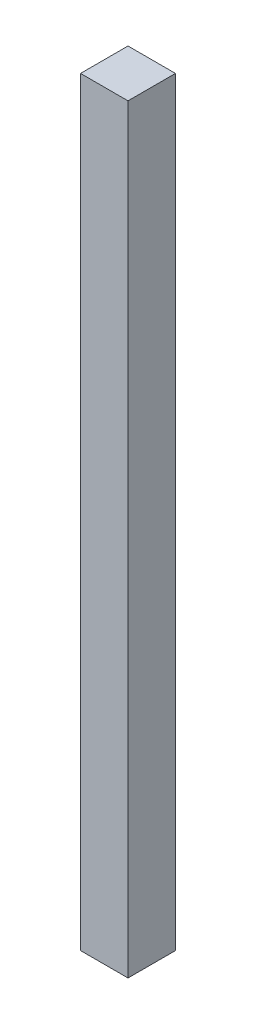
ISO-10303-21;
HEADER;
FILE_DESCRIPTION(('STEP AP214'),'2;1');
FILE_NAME('part.step','',(''),(''),'','','');
FILE_SCHEMA(('AUTOMOTIVE_DESIGN { 1 0 10303 214 1 1 1 1 }'));
ENDSEC;
DATA;
#1=APPLICATION_CONTEXT('core data for automotive mechanical design processes');
#2=APPLICATION_PROTOCOL_DEFINITION('international standard','automotive_design',2000,#1);
#3=PRODUCT_CONTEXT('',#1,'mechanical');
#4=PRODUCT('Part','Part','',(#3));
#5=PRODUCT_RELATED_PRODUCT_CATEGORY('part','',(#4));
#6=PRODUCT_DEFINITION_FORMATION('','',#4);
#7=PRODUCT_DEFINITION_CONTEXT('part definition',#1,'design');
#8=PRODUCT_DEFINITION('design','',#6,#7);
#9=PRODUCT_DEFINITION_SHAPE('','',#8);
#10=(LENGTH_UNIT() NAMED_UNIT(*) SI_UNIT(.MILLI.,.METRE.));
#11=(NAMED_UNIT(*) PLANE_ANGLE_UNIT() SI_UNIT($,.RADIAN.));
#12=(NAMED_UNIT(*) SI_UNIT($,.STERADIAN.) SOLID_ANGLE_UNIT());
#13=UNCERTAINTY_MEASURE_WITH_UNIT(LENGTH_MEASURE(1.E-05),#10,'distance_accuracy_value','');
#14=(GEOMETRIC_REPRESENTATION_CONTEXT(3) GLOBAL_UNCERTAINTY_ASSIGNED_CONTEXT((#13)) GLOBAL_UNIT_ASSIGNED_CONTEXT((#10,
#11,#12)) REPRESENTATION_CONTEXT('',''));
#15=CARTESIAN_POINT('',(0.,0.,0.));
#16=DIRECTION('',(0.,0.,1.));
#17=DIRECTION('',(1.,0.,0.));
#18=AXIS2_PLACEMENT_3D('',#15,#16,#17);
#19=CARTESIAN_POINT('',(0.,400.,0.));
#20=DIRECTION('',(1.,0.,0.));
#21=DIRECTION('',(0.,0.,-1.));
#22=AXIS2_PLACEMENT_3D('',#19,#20,#21);
#23=PLANE('',#22);
#24=DIRECTION('',(0.,0.,1.));
#25=VECTOR('',#24,1.);
#26=CARTESIAN_POINT('',(0.,0.,0.));
#27=LINE('',#26,#25);
#28=CARTESIAN_POINT('',(0.,0.,0.));
#29=VERTEX_POINT('',#28);
#30=CARTESIAN_POINT('',(0.,0.,25.));
#31=VERTEX_POINT('',#30);
#32=EDGE_CURVE('E98',#29,#31,#27,.T.);
#33=ORIENTED_EDGE('',*,*,#32,.F.);
#34=DIRECTION('',(0.,-1.,0.));
#35=VECTOR('',#34,1.);
#36=CARTESIAN_POINT('',(0.,400.,0.));
#37=LINE('',#36,#35);
#38=CARTESIAN_POINT('',(0.,400.,0.));
#39=VERTEX_POINT('',#38);
#40=EDGE_CURVE('E11',#39,#29,#37,.T.);
#41=ORIENTED_EDGE('',*,*,#40,.F.);
#42=DIRECTION('',(0.,0.,1.));
#43=VECTOR('',#42,1.);
#44=CARTESIAN_POINT('',(0.,400.,0.));
#45=LINE('',#44,#43);
#46=CARTESIAN_POINT('',(0.,400.,25.));
#47=VERTEX_POINT('',#46);
#48=EDGE_CURVE('E93',#39,#47,#45,.T.);
#49=ORIENTED_EDGE('',*,*,#48,.T.);
#50=DIRECTION('',(0.,-1.,0.));
#51=VECTOR('',#50,1.);
#52=CARTESIAN_POINT('',(0.,400.,25.));
#53=LINE('',#52,#51);
#54=EDGE_CURVE('E36',#47,#31,#53,.T.);
#55=ORIENTED_EDGE('',*,*,#54,.T.);
#56=EDGE_LOOP('',(#33,#41,#49,#55));
#57=FACE_BOUND('',#56,.T.);
#58=ADVANCED_FACE('F33',(#57),#23,.T.);
#59=CARTESIAN_POINT('',(0.,400.,0.));
#60=DIRECTION('',(0.,0.,1.));
#61=DIRECTION('',(1.,0.,0.));
#62=AXIS2_PLACEMENT_3D('',#59,#60,#61);
#63=PLANE('',#62);
#64=DIRECTION('',(-1.,0.,0.));
#65=VECTOR('',#64,1.);
#66=CARTESIAN_POINT('',(0.,0.,0.));
#67=LINE('',#66,#65);
#68=CARTESIAN_POINT('',(-25.,0.,0.));
#69=VERTEX_POINT('',#68);
#70=EDGE_CURVE('E66',#29,#69,#67,.T.);
#71=ORIENTED_EDGE('',*,*,#70,.T.);
#72=DIRECTION('',(0.,-1.,0.));
#73=VECTOR('',#72,1.);
#74=CARTESIAN_POINT('',(-25.,400.,0.));
#75=LINE('',#74,#73);
#76=CARTESIAN_POINT('',(-25.,400.,0.));
#77=VERTEX_POINT('',#76);
#78=EDGE_CURVE('E42',#77,#69,#75,.T.);
#79=ORIENTED_EDGE('',*,*,#78,.F.);
#80=DIRECTION('',(-1.,0.,0.));
#81=VECTOR('',#80,1.);
#82=CARTESIAN_POINT('',(0.,400.,0.));
#83=LINE('',#82,#81);
#84=EDGE_CURVE('E83',#39,#77,#83,.T.);
#85=ORIENTED_EDGE('',*,*,#84,.F.);
#86=ORIENTED_EDGE('',*,*,#40,.T.);
#87=EDGE_LOOP('',(#71,#79,#85,#86));
#88=FACE_BOUND('',#87,.T.);
#89=ADVANCED_FACE('F108',(#88),#63,.F.);
#90=CARTESIAN_POINT('',(-25.,400.,0.));
#91=DIRECTION('',(1.,0.,0.));
#92=DIRECTION('',(0.,0.,-1.));
#93=AXIS2_PLACEMENT_3D('',#90,#91,#92);
#94=PLANE('',#93);
#95=DIRECTION('',(0.,0.,1.));
#96=VECTOR('',#95,1.);
#97=CARTESIAN_POINT('',(-25.,0.,0.));
#98=LINE('',#97,#96);
#99=CARTESIAN_POINT('',(-25.,0.,25.));
#100=VERTEX_POINT('',#99);
#101=EDGE_CURVE('E90',#69,#100,#98,.T.);
#102=ORIENTED_EDGE('',*,*,#101,.T.);
#103=DIRECTION('',(0.,-1.,0.));
#104=VECTOR('',#103,1.);
#105=CARTESIAN_POINT('',(-25.,400.,25.));
#106=LINE('',#105,#104);
#107=CARTESIAN_POINT('',(-25.,400.,25.));
#108=VERTEX_POINT('',#107);
#109=EDGE_CURVE('E87',#108,#100,#106,.T.);
#110=ORIENTED_EDGE('',*,*,#109,.F.);
#111=DIRECTION('',(0.,0.,1.));
#112=VECTOR('',#111,1.);
#113=CARTESIAN_POINT('',(-25.,400.,0.));
#114=LINE('',#113,#112);
#115=EDGE_CURVE('E78',#77,#108,#114,.T.);
#116=ORIENTED_EDGE('',*,*,#115,.F.);
#117=ORIENTED_EDGE('',*,*,#78,.T.);
#118=EDGE_LOOP('',(#102,#110,#116,#117));
#119=FACE_BOUND('',#118,.T.);
#120=ADVANCED_FACE('F88',(#119),#94,.F.);
#121=CARTESIAN_POINT('',(0.,400.,25.));
#122=DIRECTION('',(0.,0.,1.));
#123=DIRECTION('',(1.,0.,0.));
#124=AXIS2_PLACEMENT_3D('',#121,#122,#123);
#125=PLANE('',#124);
#126=DIRECTION('',(-1.,0.,0.));
#127=VECTOR('',#126,1.);
#128=CARTESIAN_POINT('',(0.,0.,25.));
#129=LINE('',#128,#127);
#130=EDGE_CURVE('E101',#31,#100,#129,.T.);
#131=ORIENTED_EDGE('',*,*,#130,.F.);
#132=ORIENTED_EDGE('',*,*,#54,.F.);
#133=DIRECTION('',(-1.,0.,0.));
#134=VECTOR('',#133,1.);
#135=CARTESIAN_POINT('',(0.,400.,25.));
#136=LINE('',#135,#134);
#137=EDGE_CURVE('E82',#47,#108,#136,.T.);
#138=ORIENTED_EDGE('',*,*,#137,.T.);
#139=ORIENTED_EDGE('',*,*,#109,.T.);
#140=EDGE_LOOP('',(#131,#132,#138,#139));
#141=FACE_BOUND('',#140,.T.);
#142=ADVANCED_FACE('F92',(#141),#125,.T.);
#143=CARTESIAN_POINT('',(0.,400.,0.));
#144=DIRECTION('',(0.,-1.,0.));
#145=DIRECTION('',(0.,0.,-1.));
#146=AXIS2_PLACEMENT_3D('',#143,#144,#145);
#147=PLANE('',#146);
#148=ORIENTED_EDGE('',*,*,#48,.F.);
#149=ORIENTED_EDGE('',*,*,#84,.T.);
#150=ORIENTED_EDGE('',*,*,#115,.T.);
#151=ORIENTED_EDGE('',*,*,#137,.F.);
#152=EDGE_LOOP('',(#148,#149,#150,#151));
#153=FACE_BOUND('',#152,.T.);
#154=ADVANCED_FACE('F81',(#153),#147,.F.);
#155=CARTESIAN_POINT('',(0.,0.,0.));
#156=DIRECTION('',(0.,-1.,0.));
#157=DIRECTION('',(0.,0.,-1.));
#158=AXIS2_PLACEMENT_3D('',#155,#156,#157);
#159=PLANE('',#158);
#160=ORIENTED_EDGE('',*,*,#32,.T.);
#161=ORIENTED_EDGE('',*,*,#130,.T.);
#162=ORIENTED_EDGE('',*,*,#101,.F.);
#163=ORIENTED_EDGE('',*,*,#70,.F.);
#164=EDGE_LOOP('',(#160,#161,#162,#163));
#165=FACE_BOUND('',#164,.T.);
#166=ADVANCED_FACE('F106',(#165),#159,.T.);
#167=CLOSED_SHELL('',(#58,#89,#120,#142,#154,#166));
#168=MANIFOLD_SOLID_BREP('B2',#167);
#169=ADVANCED_BREP_SHAPE_REPRESENTATION('',(#18,#168),#14);
#170=SHAPE_DEFINITION_REPRESENTATION(#9,#169);
ENDSEC;
END-ISO-10303-21;
